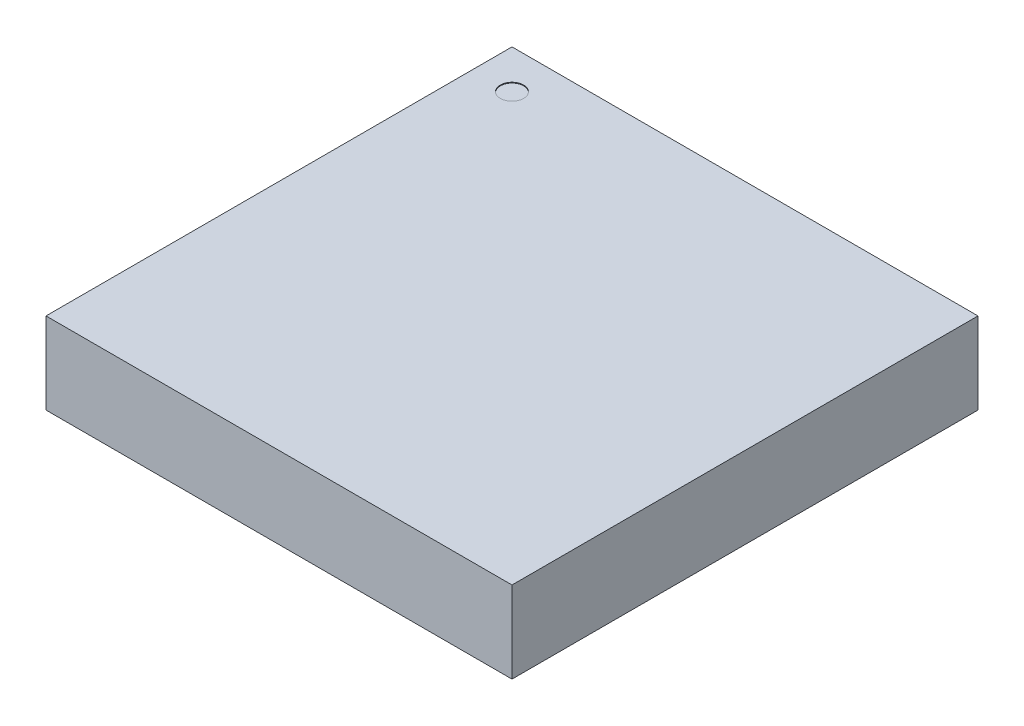
ISO-10303-21;
HEADER;
FILE_DESCRIPTION(('STEP AP214'),'2;1');
FILE_NAME('part.step','',(''),(''),'','','');
FILE_SCHEMA(('AUTOMOTIVE_DESIGN { 1 0 10303 214 1 1 1 1 }'));
ENDSEC;
DATA;
#1=APPLICATION_CONTEXT('core data for automotive mechanical design processes');
#2=APPLICATION_PROTOCOL_DEFINITION('international standard','automotive_design',2000,#1);
#3=PRODUCT_CONTEXT('',#1,'mechanical');
#4=PRODUCT('Part','Part','',(#3));
#5=PRODUCT_RELATED_PRODUCT_CATEGORY('part','',(#4));
#6=PRODUCT_DEFINITION_FORMATION('','',#4);
#7=PRODUCT_DEFINITION_CONTEXT('part definition',#1,'design');
#8=PRODUCT_DEFINITION('design','',#6,#7);
#9=PRODUCT_DEFINITION_SHAPE('','',#8);
#10=(LENGTH_UNIT() NAMED_UNIT(*) SI_UNIT(.MILLI.,.METRE.));
#11=(NAMED_UNIT(*) PLANE_ANGLE_UNIT() SI_UNIT($,.RADIAN.));
#12=(NAMED_UNIT(*) SI_UNIT($,.STERADIAN.) SOLID_ANGLE_UNIT());
#13=UNCERTAINTY_MEASURE_WITH_UNIT(LENGTH_MEASURE(1.E-05),#10,'distance_accuracy_value','');
#14=(GEOMETRIC_REPRESENTATION_CONTEXT(3) GLOBAL_UNCERTAINTY_ASSIGNED_CONTEXT((#13)) GLOBAL_UNIT_ASSIGNED_CONTEXT((#10,
#11,#12)) REPRESENTATION_CONTEXT('',''));
#15=CARTESIAN_POINT('',(0.,0.,0.));
#16=DIRECTION('',(0.,0.,1.));
#17=DIRECTION('',(1.,0.,0.));
#18=AXIS2_PLACEMENT_3D('',#15,#16,#17);
#19=CARTESIAN_POINT('',(-2.28352206498866,1.05,-2.89953280277875));
#20=DIRECTION('',(1.,0.,0.));
#21=DIRECTION('',(0.,0.,-1.));
#22=AXIS2_PLACEMENT_3D('',#19,#20,#21);
#23=PLANE('',#22);
#24=DIRECTION('',(0.,0.,1.));
#25=VECTOR('',#24,1.);
#26=CARTESIAN_POINT('',(-2.28352206498866,0.,-2.89953280277875));
#27=LINE('',#26,#25);
#28=CARTESIAN_POINT('',(-2.28352206498866,0.,-2.89953280277875));
#29=VERTEX_POINT('',#28);
#30=CARTESIAN_POINT('',(-2.28352206498866,0.,3.10046719722125));
#31=VERTEX_POINT('',#30);
#32=EDGE_CURVE('E113',#29,#31,#27,.T.);
#33=ORIENTED_EDGE('',*,*,#32,.T.);
#34=DIRECTION('',(0.,-1.,0.));
#35=VECTOR('',#34,1.);
#36=CARTESIAN_POINT('',(-2.28352206498866,1.05,3.10046719722125));
#37=LINE('',#36,#35);
#38=CARTESIAN_POINT('',(-2.28352206498866,1.05,3.10046719722125));
#39=VERTEX_POINT('',#38);
#40=EDGE_CURVE('E11',#39,#31,#37,.T.);
#41=ORIENTED_EDGE('',*,*,#40,.F.);
#42=DIRECTION('',(0.,0.,1.));
#43=VECTOR('',#42,1.);
#44=CARTESIAN_POINT('',(-2.28352206498866,1.05,-2.89953280277875));
#45=LINE('',#44,#43);
#46=CARTESIAN_POINT('',(-2.28352206498866,1.05,-2.89953280277875));
#47=VERTEX_POINT('',#46);
#48=EDGE_CURVE('E95',#47,#39,#45,.T.);
#49=ORIENTED_EDGE('',*,*,#48,.F.);
#50=DIRECTION('',(0.,-1.,0.));
#51=VECTOR('',#50,1.);
#52=CARTESIAN_POINT('',(-2.28352206498866,1.05,-2.89953280277875));
#53=LINE('',#52,#51);
#54=EDGE_CURVE('E109',#47,#29,#53,.T.);
#55=ORIENTED_EDGE('',*,*,#54,.T.);
#56=EDGE_LOOP('',(#33,#41,#49,#55));
#57=FACE_BOUND('',#56,.T.);
#58=ADVANCED_FACE('F43',(#57),#23,.F.);
#59=CARTESIAN_POINT('',(-2.28352206498866,1.05,3.10046719722125));
#60=DIRECTION('',(0.,0.,-1.));
#61=DIRECTION('',(-1.,0.,0.));
#62=AXIS2_PLACEMENT_3D('',#59,#60,#61);
#63=PLANE('',#62);
#64=DIRECTION('',(1.,0.,0.));
#65=VECTOR('',#64,1.);
#66=CARTESIAN_POINT('',(-2.28352206498866,0.,3.10046719722125));
#67=LINE('',#66,#65);
#68=CARTESIAN_POINT('',(3.71647793501134,0.,3.10046719722125));
#69=VERTEX_POINT('',#68);
#70=EDGE_CURVE('E100',#31,#69,#67,.T.);
#71=ORIENTED_EDGE('',*,*,#70,.T.);
#72=DIRECTION('',(0.,-1.,0.));
#73=VECTOR('',#72,1.);
#74=CARTESIAN_POINT('',(3.71647793501134,1.05,3.10046719722125));
#75=LINE('',#74,#73);
#76=CARTESIAN_POINT('',(3.71647793501134,1.05,3.10046719722125));
#77=VERTEX_POINT('',#76);
#78=EDGE_CURVE('E52',#77,#69,#75,.T.);
#79=ORIENTED_EDGE('',*,*,#78,.F.);
#80=DIRECTION('',(1.,0.,0.));
#81=VECTOR('',#80,1.);
#82=CARTESIAN_POINT('',(-2.28352206498866,1.05,3.10046719722125));
#83=LINE('',#82,#81);
#84=EDGE_CURVE('E90',#39,#77,#83,.T.);
#85=ORIENTED_EDGE('',*,*,#84,.F.);
#86=ORIENTED_EDGE('',*,*,#40,.T.);
#87=EDGE_LOOP('',(#71,#79,#85,#86));
#88=FACE_BOUND('',#87,.T.);
#89=ADVANCED_FACE('F99',(#88),#63,.F.);
#90=CARTESIAN_POINT('',(3.71647793501134,1.05,-2.89953280277875));
#91=DIRECTION('',(-1.,0.,0.));
#92=DIRECTION('',(0.,0.,1.));
#93=AXIS2_PLACEMENT_3D('',#90,#91,#92);
#94=PLANE('',#93);
#95=DIRECTION('',(0.,0.,-1.));
#96=VECTOR('',#95,1.);
#97=CARTESIAN_POINT('',(3.71647793501134,0.,-2.89953280277875));
#98=LINE('',#97,#96);
#99=CARTESIAN_POINT('',(3.71647793501134,0.,-2.89953280277875));
#100=VERTEX_POINT('',#99);
#101=EDGE_CURVE('E77',#69,#100,#98,.T.);
#102=ORIENTED_EDGE('',*,*,#101,.T.);
#103=DIRECTION('',(0.,-1.,0.));
#104=VECTOR('',#103,1.);
#105=CARTESIAN_POINT('',(3.71647793501134,1.05,-2.89953280277875));
#106=LINE('',#105,#104);
#107=CARTESIAN_POINT('',(3.71647793501134,1.05,-2.89953280277875));
#108=VERTEX_POINT('',#107);
#109=EDGE_CURVE('E102',#108,#100,#106,.T.);
#110=ORIENTED_EDGE('',*,*,#109,.F.);
#111=DIRECTION('',(0.,0.,-1.));
#112=VECTOR('',#111,1.);
#113=CARTESIAN_POINT('',(3.71647793501134,1.05,-2.89953280277875));
#114=LINE('',#113,#112);
#115=EDGE_CURVE('E93',#77,#108,#114,.T.);
#116=ORIENTED_EDGE('',*,*,#115,.F.);
#117=ORIENTED_EDGE('',*,*,#78,.T.);
#118=EDGE_LOOP('',(#102,#110,#116,#117));
#119=FACE_BOUND('',#118,.T.);
#120=ADVANCED_FACE('F103',(#119),#94,.F.);
#121=CARTESIAN_POINT('',(-2.28352206498866,1.05,-2.89953280277875));
#122=DIRECTION('',(0.,0.,1.));
#123=DIRECTION('',(1.,0.,0.));
#124=AXIS2_PLACEMENT_3D('',#121,#122,#123);
#125=PLANE('',#124);
#126=DIRECTION('',(-1.,0.,0.));
#127=VECTOR('',#126,1.);
#128=CARTESIAN_POINT('',(-2.28352206498866,0.,-2.89953280277875));
#129=LINE('',#128,#127);
#130=EDGE_CURVE('E83',#100,#29,#129,.T.);
#131=ORIENTED_EDGE('',*,*,#130,.T.);
#132=ORIENTED_EDGE('',*,*,#54,.F.);
#133=DIRECTION('',(-1.,0.,0.));
#134=VECTOR('',#133,1.);
#135=CARTESIAN_POINT('',(-2.28352206498866,1.05,-2.89953280277875));
#136=LINE('',#135,#134);
#137=EDGE_CURVE('E60',#108,#47,#136,.T.);
#138=ORIENTED_EDGE('',*,*,#137,.F.);
#139=ORIENTED_EDGE('',*,*,#109,.T.);
#140=EDGE_LOOP('',(#131,#132,#138,#139));
#141=FACE_BOUND('',#140,.T.);
#142=ADVANCED_FACE('F127',(#141),#125,.F.);
#143=CARTESIAN_POINT('',(0.,1.05,0.));
#144=DIRECTION('',(0.,1.,0.));
#145=DIRECTION('',(0.,0.,1.));
#146=AXIS2_PLACEMENT_3D('',#143,#144,#145);
#147=PLANE('',#146);
#148=CARTESIAN_POINT('',(-1.78352206498866,1.05,-2.39953280277875));
#149=DIRECTION('',(0.,1.,0.));
#150=DIRECTION('',(0.,0.,1.));
#151=AXIS2_PLACEMENT_3D('',#148,#149,#150);
#152=CIRCLE('',#151,0.15);
#153=CARTESIAN_POINT('',(-1.78352206498866,1.05,-2.24953280277875));
#154=VERTEX_POINT('',#153);
#155=EDGE_CURVE('E133',#154,#154,#152,.T.);
#156=ORIENTED_EDGE('',*,*,#155,.F.);
#157=EDGE_LOOP('',(#156));
#158=FACE_BOUND('',#157,.T.);
#159=ORIENTED_EDGE('',*,*,#48,.T.);
#160=ORIENTED_EDGE('',*,*,#84,.T.);
#161=ORIENTED_EDGE('',*,*,#115,.T.);
#162=ORIENTED_EDGE('',*,*,#137,.T.);
#163=EDGE_LOOP('',(#159,#160,#161,#162));
#164=FACE_BOUND('',#163,.T.);
#165=ADVANCED_FACE('F91',(#158,#164),#147,.T.);
#166=CARTESIAN_POINT('',(0.,0.,0.));
#167=DIRECTION('',(0.,1.,0.));
#168=DIRECTION('',(0.,0.,1.));
#169=AXIS2_PLACEMENT_3D('',#166,#167,#168);
#170=PLANE('',#169);
#171=ORIENTED_EDGE('',*,*,#32,.F.);
#172=ORIENTED_EDGE('',*,*,#130,.F.);
#173=ORIENTED_EDGE('',*,*,#101,.F.);
#174=ORIENTED_EDGE('',*,*,#70,.F.);
#175=EDGE_LOOP('',(#171,#172,#173,#174));
#176=FACE_BOUND('',#175,.T.);
#177=ADVANCED_FACE('F130',(#176),#170,.F.);
#178=CARTESIAN_POINT('',(-1.78352206498866,1.04,-2.39953280277875));
#179=DIRECTION('',(0.,1.,0.));
#180=DIRECTION('',(0.,0.,1.));
#181=AXIS2_PLACEMENT_3D('',#178,#179,#180);
#182=CYLINDRICAL_SURFACE('',#181,0.15);
#183=CARTESIAN_POINT('',(-1.78352206498866,1.04,-2.39953280277875));
#184=DIRECTION('',(0.,1.,0.));
#185=DIRECTION('',(0.,0.,1.));
#186=AXIS2_PLACEMENT_3D('',#183,#184,#185);
#187=CIRCLE('',#186,0.15);
#188=CARTESIAN_POINT('',(-1.78352206498866,1.04,-2.24953280277875));
#189=VERTEX_POINT('',#188);
#190=EDGE_CURVE('E117',#189,#189,#187,.T.);
#191=ORIENTED_EDGE('',*,*,#190,.F.);
#192=EDGE_LOOP('',(#191));
#193=FACE_BOUND('',#192,.T.);
#194=ORIENTED_EDGE('',*,*,#155,.T.);
#195=EDGE_LOOP('',(#194));
#196=FACE_BOUND('',#195,.T.);
#197=ADVANCED_FACE('F142',(#193,#196),#182,.F.);
#198=CARTESIAN_POINT('',(-1.78352206498866,1.04,-2.39953280277875));
#199=DIRECTION('',(0.,1.,0.));
#200=DIRECTION('',(0.,0.,1.));
#201=AXIS2_PLACEMENT_3D('',#198,#199,#200);
#202=PLANE('',#201);
#203=ORIENTED_EDGE('',*,*,#190,.T.);
#204=EDGE_LOOP('',(#203));
#205=FACE_BOUND('',#204,.T.);
#206=ADVANCED_FACE('F140',(#205),#202,.T.);
#207=CLOSED_SHELL('',(#58,#89,#120,#142,#165,#177,#197,#206));
#208=MANIFOLD_SOLID_BREP('B2',#207);
#209=ADVANCED_BREP_SHAPE_REPRESENTATION('',(#18,#208),#14);
#210=SHAPE_DEFINITION_REPRESENTATION(#9,#209);
ENDSEC;
END-ISO-10303-21;
